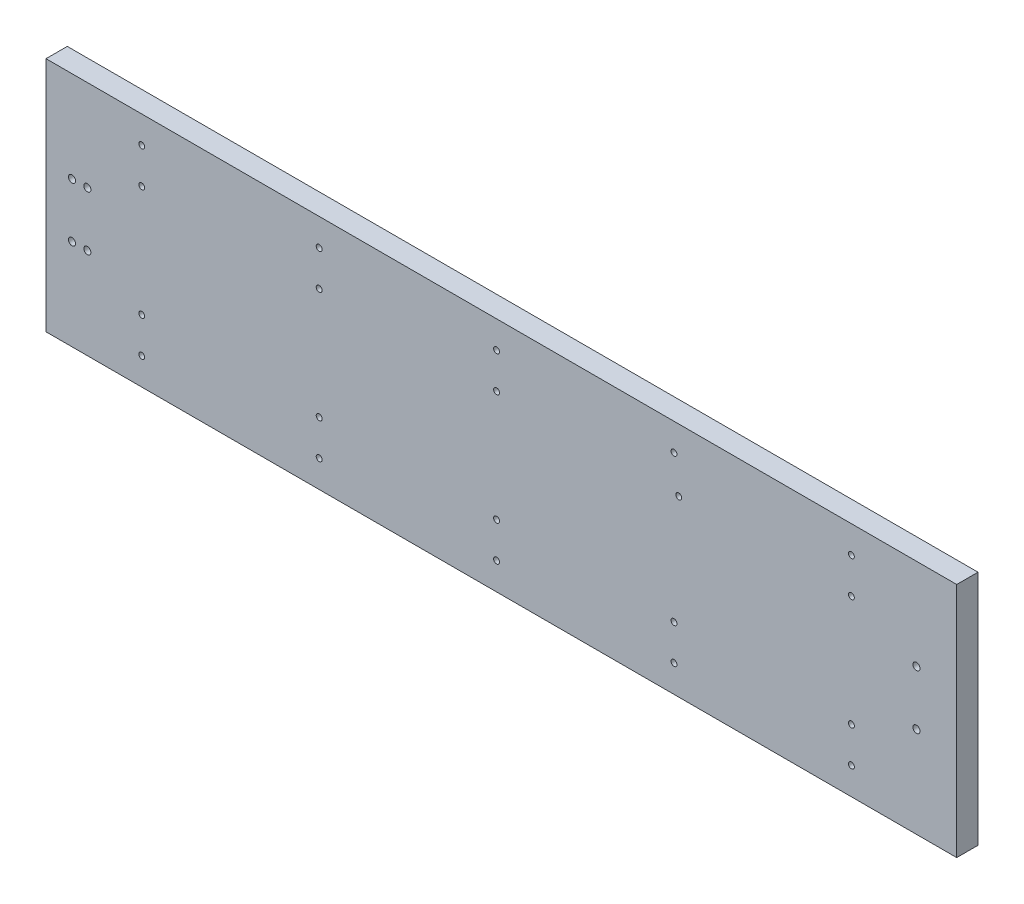
ISO-10303-21;
HEADER;
FILE_DESCRIPTION(('STEP AP214'),'2;1');
FILE_NAME('part.step','',(''),(''),'','','');
FILE_SCHEMA(('AUTOMOTIVE_DESIGN { 1 0 10303 214 1 1 1 1 }'));
ENDSEC;
DATA;
#1=APPLICATION_CONTEXT('core data for automotive mechanical design processes');
#2=APPLICATION_PROTOCOL_DEFINITION('international standard','automotive_design',2000,#1);
#3=PRODUCT_CONTEXT('',#1,'mechanical');
#4=PRODUCT('Part','Part','',(#3));
#5=PRODUCT_RELATED_PRODUCT_CATEGORY('part','',(#4));
#6=PRODUCT_DEFINITION_FORMATION('','',#4);
#7=PRODUCT_DEFINITION_CONTEXT('part definition',#1,'design');
#8=PRODUCT_DEFINITION('design','',#6,#7);
#9=PRODUCT_DEFINITION_SHAPE('','',#8);
#10=(LENGTH_UNIT() NAMED_UNIT(*) SI_UNIT(.MILLI.,.METRE.));
#11=(NAMED_UNIT(*) PLANE_ANGLE_UNIT() SI_UNIT($,.RADIAN.));
#12=(NAMED_UNIT(*) SI_UNIT($,.STERADIAN.) SOLID_ANGLE_UNIT());
#13=UNCERTAINTY_MEASURE_WITH_UNIT(LENGTH_MEASURE(1.E-05),#10,'distance_accuracy_value','');
#14=(GEOMETRIC_REPRESENTATION_CONTEXT(3) GLOBAL_UNCERTAINTY_ASSIGNED_CONTEXT((#13)) GLOBAL_UNIT_ASSIGNED_CONTEXT((#10,
#11,#12)) REPRESENTATION_CONTEXT('',''));
#15=CARTESIAN_POINT('',(0.,0.,0.));
#16=DIRECTION('',(0.,0.,1.));
#17=DIRECTION('',(1.,0.,0.));
#18=AXIS2_PLACEMENT_3D('',#15,#16,#17);
#19=CARTESIAN_POINT('',(0.,0.,18.));
#20=DIRECTION('',(0.,0.,1.));
#21=DIRECTION('',(1.,0.,0.));
#22=AXIS2_PLACEMENT_3D('',#19,#20,#21);
#23=PLANE('',#22);
#24=CARTESIAN_POINT('',(350.960797655733,23.,18.));
#25=DIRECTION('',(0.,0.,-1.));
#26=DIRECTION('',(-1.,0.,0.));
#27=AXIS2_PLACEMENT_3D('',#24,#25,#26);
#28=CIRCLE('',#27,3.);
#29=CARTESIAN_POINT('',(347.960797655733,23.,18.));
#30=VERTEX_POINT('',#29);
#31=EDGE_CURVE('E261',#30,#30,#28,.T.);
#32=ORIENTED_EDGE('',*,*,#31,.T.);
#33=EDGE_LOOP('',(#32));
#34=FACE_BOUND('',#33,.T.);
#35=CARTESIAN_POINT('',(350.960797655733,-23.,18.));
#36=DIRECTION('',(0.,0.,-1.));
#37=DIRECTION('',(-1.,0.,0.));
#38=AXIS2_PLACEMENT_3D('',#35,#36,#37);
#39=CIRCLE('',#38,3.);
#40=CARTESIAN_POINT('',(347.960797655733,-23.,18.));
#41=VERTEX_POINT('',#40);
#42=EDGE_CURVE('E255',#41,#41,#39,.T.);
#43=ORIENTED_EDGE('',*,*,#42,.T.);
#44=EDGE_LOOP('',(#43));
#45=FACE_BOUND('',#44,.T.);
#46=DIRECTION('',(0.,1.,0.));
#47=VECTOR('',#46,1.);
#48=CARTESIAN_POINT('',(385.,100.,18.));
#49=LINE('',#48,#47);
#50=CARTESIAN_POINT('',(385.,-100.,18.));
#51=VERTEX_POINT('',#50);
#52=CARTESIAN_POINT('',(385.,100.,18.));
#53=VERTEX_POINT('',#52);
#54=EDGE_CURVE('E85',#51,#53,#49,.T.);
#55=ORIENTED_EDGE('',*,*,#54,.T.);
#56=DIRECTION('',(-1.,0.,0.));
#57=VECTOR('',#56,1.);
#58=CARTESIAN_POINT('',(-385.,100.,18.));
#59=LINE('',#58,#57);
#60=CARTESIAN_POINT('',(-385.,100.,18.));
#61=VERTEX_POINT('',#60);
#62=EDGE_CURVE('E80',#53,#61,#59,.T.);
#63=ORIENTED_EDGE('',*,*,#62,.T.);
#64=DIRECTION('',(0.,-1.,0.));
#65=VECTOR('',#64,1.);
#66=CARTESIAN_POINT('',(-385.,100.,18.));
#67=LINE('',#66,#65);
#68=CARTESIAN_POINT('',(-385.,-100.,18.));
#69=VERTEX_POINT('',#68);
#70=EDGE_CURVE('E83',#61,#69,#67,.T.);
#71=ORIENTED_EDGE('',*,*,#70,.T.);
#72=DIRECTION('',(1.,0.,0.));
#73=VECTOR('',#72,1.);
#74=CARTESIAN_POINT('',(-385.,-100.,18.));
#75=LINE('',#74,#73);
#76=EDGE_CURVE('E50',#69,#51,#75,.T.);
#77=ORIENTED_EDGE('',*,*,#76,.T.);
#78=EDGE_LOOP('',(#55,#63,#71,#77));
#79=FACE_BOUND('',#78,.T.);
#80=CARTESIAN_POINT('',(295.960122186734,-77.0000000000001,18.));
#81=DIRECTION('',(0.,0.,-1.));
#82=DIRECTION('',(-1.,0.,0.));
#83=AXIS2_PLACEMENT_3D('',#80,#81,#82);
#84=CIRCLE('',#83,2.5);
#85=CARTESIAN_POINT('',(293.460122186734,-77.0000000000001,18.));
#86=VERTEX_POINT('',#85);
#87=EDGE_CURVE('E100',#86,#86,#84,.T.);
#88=ORIENTED_EDGE('',*,*,#87,.T.);
#89=EDGE_LOOP('',(#88));
#90=FACE_BOUND('',#89,.T.);
#91=CARTESIAN_POINT('',(295.960122186734,-47.0000000000001,18.));
#92=DIRECTION('',(0.,0.,-1.));
#93=DIRECTION('',(-1.,0.,0.));
#94=AXIS2_PLACEMENT_3D('',#91,#92,#93);
#95=CIRCLE('',#94,2.5);
#96=CARTESIAN_POINT('',(293.460122186734,-47.0000000000001,18.));
#97=VERTEX_POINT('',#96);
#98=EDGE_CURVE('E117',#97,#97,#95,.T.);
#99=ORIENTED_EDGE('',*,*,#98,.T.);
#100=EDGE_LOOP('',(#99));
#101=FACE_BOUND('',#100,.T.);
#102=CARTESIAN_POINT('',(145.960122186734,-47.,18.));
#103=DIRECTION('',(0.,0.,-1.));
#104=DIRECTION('',(-1.,0.,0.));
#105=AXIS2_PLACEMENT_3D('',#102,#103,#104);
#106=CIRCLE('',#105,2.5);
#107=CARTESIAN_POINT('',(143.460122186734,-47.,18.));
#108=VERTEX_POINT('',#107);
#109=EDGE_CURVE('E123',#108,#108,#106,.T.);
#110=ORIENTED_EDGE('',*,*,#109,.T.);
#111=EDGE_LOOP('',(#110));
#112=FACE_BOUND('',#111,.T.);
#113=CARTESIAN_POINT('',(145.960122186734,-77.,18.));
#114=DIRECTION('',(0.,0.,-1.));
#115=DIRECTION('',(-1.,0.,0.));
#116=AXIS2_PLACEMENT_3D('',#113,#114,#115);
#117=CIRCLE('',#116,2.5);
#118=CARTESIAN_POINT('',(143.460122186734,-77.,18.));
#119=VERTEX_POINT('',#118);
#120=EDGE_CURVE('E129',#119,#119,#117,.T.);
#121=ORIENTED_EDGE('',*,*,#120,.T.);
#122=EDGE_LOOP('',(#121));
#123=FACE_BOUND('',#122,.T.);
#124=CARTESIAN_POINT('',(-4.03987781326559,-76.9999999999999,18.));
#125=DIRECTION('',(0.,0.,-1.));
#126=DIRECTION('',(-1.,0.,0.));
#127=AXIS2_PLACEMENT_3D('',#124,#125,#126);
#128=CIRCLE('',#127,2.49999999999999);
#129=CARTESIAN_POINT('',(-6.53987781326558,-76.9999999999999,18.));
#130=VERTEX_POINT('',#129);
#131=EDGE_CURVE('E135',#130,#130,#128,.T.);
#132=ORIENTED_EDGE('',*,*,#131,.T.);
#133=EDGE_LOOP('',(#132));
#134=FACE_BOUND('',#133,.T.);
#135=CARTESIAN_POINT('',(-4.03987781326559,-46.9999999999999,18.));
#136=DIRECTION('',(0.,0.,-1.));
#137=DIRECTION('',(-1.,0.,0.));
#138=AXIS2_PLACEMENT_3D('',#135,#136,#137);
#139=CIRCLE('',#138,2.49999999999999);
#140=CARTESIAN_POINT('',(-6.53987781326558,-46.9999999999999,18.));
#141=VERTEX_POINT('',#140);
#142=EDGE_CURVE('E141',#141,#141,#139,.T.);
#143=ORIENTED_EDGE('',*,*,#142,.T.);
#144=EDGE_LOOP('',(#143));
#145=FACE_BOUND('',#144,.T.);
#146=CARTESIAN_POINT('',(-154.039877813266,-46.9999999999998,18.));
#147=DIRECTION('',(0.,0.,-1.));
#148=DIRECTION('',(-1.,0.,0.));
#149=AXIS2_PLACEMENT_3D('',#146,#147,#148);
#150=CIRCLE('',#149,2.5);
#151=CARTESIAN_POINT('',(-156.539877813266,-46.9999999999998,18.));
#152=VERTEX_POINT('',#151);
#153=EDGE_CURVE('E147',#152,#152,#150,.T.);
#154=ORIENTED_EDGE('',*,*,#153,.T.);
#155=EDGE_LOOP('',(#154));
#156=FACE_BOUND('',#155,.T.);
#157=CARTESIAN_POINT('',(-154.039877813266,-76.9999999999998,18.));
#158=DIRECTION('',(0.,0.,-1.));
#159=DIRECTION('',(-1.,0.,0.));
#160=AXIS2_PLACEMENT_3D('',#157,#158,#159);
#161=CIRCLE('',#160,2.5);
#162=CARTESIAN_POINT('',(-156.539877813266,-76.9999999999998,18.));
#163=VERTEX_POINT('',#162);
#164=EDGE_CURVE('E153',#163,#163,#161,.T.);
#165=ORIENTED_EDGE('',*,*,#164,.T.);
#166=EDGE_LOOP('',(#165));
#167=FACE_BOUND('',#166,.T.);
#168=CARTESIAN_POINT('',(-304.039877813266,-76.9999999999997,18.));
#169=DIRECTION('',(0.,0.,-1.));
#170=DIRECTION('',(-1.,0.,0.));
#171=AXIS2_PLACEMENT_3D('',#168,#169,#170);
#172=CIRCLE('',#171,2.5);
#173=CARTESIAN_POINT('',(-306.539877813266,-76.9999999999997,18.));
#174=VERTEX_POINT('',#173);
#175=EDGE_CURVE('E159',#174,#174,#172,.T.);
#176=ORIENTED_EDGE('',*,*,#175,.T.);
#177=EDGE_LOOP('',(#176));
#178=FACE_BOUND('',#177,.T.);
#179=CARTESIAN_POINT('',(-304.039877813266,-46.9999999999997,18.));
#180=DIRECTION('',(0.,0.,-1.));
#181=DIRECTION('',(-1.,0.,0.));
#182=AXIS2_PLACEMENT_3D('',#179,#180,#181);
#183=CIRCLE('',#182,2.5);
#184=CARTESIAN_POINT('',(-306.539877813266,-46.9999999999997,18.));
#185=VERTEX_POINT('',#184);
#186=EDGE_CURVE('E165',#185,#185,#183,.T.);
#187=ORIENTED_EDGE('',*,*,#186,.T.);
#188=EDGE_LOOP('',(#187));
#189=FACE_BOUND('',#188,.T.);
#190=CARTESIAN_POINT('',(-304.039877813266,47.0000000000004,18.));
#191=DIRECTION('',(0.,0.,-1.));
#192=DIRECTION('',(-1.,0.,0.));
#193=AXIS2_PLACEMENT_3D('',#190,#191,#192);
#194=CIRCLE('',#193,2.5);
#195=CARTESIAN_POINT('',(-306.539877813266,47.0000000000004,18.));
#196=VERTEX_POINT('',#195);
#197=EDGE_CURVE('E171',#196,#196,#194,.T.);
#198=ORIENTED_EDGE('',*,*,#197,.T.);
#199=EDGE_LOOP('',(#198));
#200=FACE_BOUND('',#199,.T.);
#201=CARTESIAN_POINT('',(-304.039877813266,77.0000000000004,18.));
#202=DIRECTION('',(0.,0.,-1.));
#203=DIRECTION('',(-1.,0.,0.));
#204=AXIS2_PLACEMENT_3D('',#201,#202,#203);
#205=CIRCLE('',#204,2.5);
#206=CARTESIAN_POINT('',(-306.539877813266,77.0000000000004,18.));
#207=VERTEX_POINT('',#206);
#208=EDGE_CURVE('E177',#207,#207,#205,.T.);
#209=ORIENTED_EDGE('',*,*,#208,.T.);
#210=EDGE_LOOP('',(#209));
#211=FACE_BOUND('',#210,.T.);
#212=CARTESIAN_POINT('',(-154.039877813266,47.0000000000004,18.));
#213=DIRECTION('',(0.,0.,-1.));
#214=DIRECTION('',(-1.,0.,0.));
#215=AXIS2_PLACEMENT_3D('',#212,#213,#214);
#216=CIRCLE('',#215,2.5);
#217=CARTESIAN_POINT('',(-156.539877813266,47.0000000000004,18.));
#218=VERTEX_POINT('',#217);
#219=EDGE_CURVE('E183',#218,#218,#216,.T.);
#220=ORIENTED_EDGE('',*,*,#219,.T.);
#221=EDGE_LOOP('',(#220));
#222=FACE_BOUND('',#221,.T.);
#223=CARTESIAN_POINT('',(-154.039877813266,77.0000000000004,18.));
#224=DIRECTION('',(0.,0.,-1.));
#225=DIRECTION('',(-1.,0.,0.));
#226=AXIS2_PLACEMENT_3D('',#223,#224,#225);
#227=CIRCLE('',#226,2.5);
#228=CARTESIAN_POINT('',(-156.539877813266,77.0000000000004,18.));
#229=VERTEX_POINT('',#228);
#230=EDGE_CURVE('E189',#229,#229,#227,.T.);
#231=ORIENTED_EDGE('',*,*,#230,.T.);
#232=EDGE_LOOP('',(#231));
#233=FACE_BOUND('',#232,.T.);
#234=CARTESIAN_POINT('',(-4.03987781326598,47.0000000000004,18.));
#235=DIRECTION('',(0.,0.,-1.));
#236=DIRECTION('',(-1.,0.,0.));
#237=AXIS2_PLACEMENT_3D('',#234,#235,#236);
#238=CIRCLE('',#237,2.49999999999999);
#239=CARTESIAN_POINT('',(-6.53987781326597,47.0000000000004,18.));
#240=VERTEX_POINT('',#239);
#241=EDGE_CURVE('E195',#240,#240,#238,.T.);
#242=ORIENTED_EDGE('',*,*,#241,.T.);
#243=EDGE_LOOP('',(#242));
#244=FACE_BOUND('',#243,.T.);
#245=CARTESIAN_POINT('',(-4.03987781326598,77.0000000000004,18.));
#246=DIRECTION('',(0.,0.,-1.));
#247=DIRECTION('',(-1.,0.,0.));
#248=AXIS2_PLACEMENT_3D('',#245,#246,#247);
#249=CIRCLE('',#248,2.49999999999999);
#250=CARTESIAN_POINT('',(-6.53987781326597,77.0000000000004,18.));
#251=VERTEX_POINT('',#250);
#252=EDGE_CURVE('E201',#251,#251,#249,.T.);
#253=ORIENTED_EDGE('',*,*,#252,.T.);
#254=EDGE_LOOP('',(#253));
#255=FACE_BOUND('',#254,.T.);
#256=CARTESIAN_POINT('',(150.,47.0000000000002,18.));
#257=DIRECTION('',(0.,0.,-1.));
#258=DIRECTION('',(-1.,0.,0.));
#259=AXIS2_PLACEMENT_3D('',#256,#257,#258);
#260=CIRCLE('',#259,2.5);
#261=CARTESIAN_POINT('',(147.5,47.0000000000002,18.));
#262=VERTEX_POINT('',#261);
#263=EDGE_CURVE('E207',#262,#262,#260,.T.);
#264=ORIENTED_EDGE('',*,*,#263,.T.);
#265=EDGE_LOOP('',(#264));
#266=FACE_BOUND('',#265,.T.);
#267=CARTESIAN_POINT('',(145.960122186734,77.0000000000004,18.));
#268=DIRECTION('',(0.,0.,-1.));
#269=DIRECTION('',(-1.,0.,0.));
#270=AXIS2_PLACEMENT_3D('',#267,#268,#269);
#271=CIRCLE('',#270,2.5);
#272=CARTESIAN_POINT('',(143.460122186734,77.0000000000004,18.));
#273=VERTEX_POINT('',#272);
#274=EDGE_CURVE('E213',#273,#273,#271,.T.);
#275=ORIENTED_EDGE('',*,*,#274,.T.);
#276=EDGE_LOOP('',(#275));
#277=FACE_BOUND('',#276,.T.);
#278=CARTESIAN_POINT('',(295.960122186734,47.0000000000004,18.));
#279=DIRECTION('',(0.,0.,-1.));
#280=DIRECTION('',(-1.,0.,0.));
#281=AXIS2_PLACEMENT_3D('',#278,#279,#280);
#282=CIRCLE('',#281,2.5);
#283=CARTESIAN_POINT('',(293.460122186734,47.0000000000004,18.));
#284=VERTEX_POINT('',#283);
#285=EDGE_CURVE('E219',#284,#284,#282,.T.);
#286=ORIENTED_EDGE('',*,*,#285,.T.);
#287=EDGE_LOOP('',(#286));
#288=FACE_BOUND('',#287,.T.);
#289=CARTESIAN_POINT('',(295.960122186734,77.0000000000004,18.));
#290=DIRECTION('',(0.,0.,-1.));
#291=DIRECTION('',(-1.,0.,0.));
#292=AXIS2_PLACEMENT_3D('',#289,#290,#291);
#293=CIRCLE('',#292,2.5);
#294=CARTESIAN_POINT('',(293.460122186734,77.0000000000004,18.));
#295=VERTEX_POINT('',#294);
#296=EDGE_CURVE('E225',#295,#295,#293,.T.);
#297=ORIENTED_EDGE('',*,*,#296,.T.);
#298=EDGE_LOOP('',(#297));
#299=FACE_BOUND('',#298,.T.);
#300=CARTESIAN_POINT('',(-363.039202344268,-22.9999999999999,18.));
#301=DIRECTION('',(0.,0.,-1.));
#302=DIRECTION('',(-1.,0.,0.));
#303=AXIS2_PLACEMENT_3D('',#300,#301,#302);
#304=CIRCLE('',#303,3.);
#305=CARTESIAN_POINT('',(-366.039202344268,-22.9999999999999,18.));
#306=VERTEX_POINT('',#305);
#307=EDGE_CURVE('E231',#306,#306,#304,.T.);
#308=ORIENTED_EDGE('',*,*,#307,.T.);
#309=EDGE_LOOP('',(#308));
#310=FACE_BOUND('',#309,.T.);
#311=CARTESIAN_POINT('',(-350.039202344268,-22.9999999999999,18.));
#312=DIRECTION('',(0.,0.,-1.));
#313=DIRECTION('',(-1.,0.,0.));
#314=AXIS2_PLACEMENT_3D('',#311,#312,#313);
#315=CIRCLE('',#314,3.);
#316=CARTESIAN_POINT('',(-353.039202344268,-22.9999999999999,18.));
#317=VERTEX_POINT('',#316);
#318=EDGE_CURVE('E237',#317,#317,#315,.T.);
#319=ORIENTED_EDGE('',*,*,#318,.T.);
#320=EDGE_LOOP('',(#319));
#321=FACE_BOUND('',#320,.T.);
#322=CARTESIAN_POINT('',(-363.039202344268,23.0000000000001,18.));
#323=DIRECTION('',(0.,0.,-1.));
#324=DIRECTION('',(-1.,0.,0.));
#325=AXIS2_PLACEMENT_3D('',#322,#323,#324);
#326=CIRCLE('',#325,3.);
#327=CARTESIAN_POINT('',(-366.039202344268,23.0000000000001,18.));
#328=VERTEX_POINT('',#327);
#329=EDGE_CURVE('E243',#328,#328,#326,.T.);
#330=ORIENTED_EDGE('',*,*,#329,.T.);
#331=EDGE_LOOP('',(#330));
#332=FACE_BOUND('',#331,.T.);
#333=CARTESIAN_POINT('',(-350.039202344268,23.0000000000001,18.));
#334=DIRECTION('',(0.,0.,-1.));
#335=DIRECTION('',(-1.,0.,0.));
#336=AXIS2_PLACEMENT_3D('',#333,#334,#335);
#337=CIRCLE('',#336,3.);
#338=CARTESIAN_POINT('',(-353.039202344268,23.0000000000001,18.));
#339=VERTEX_POINT('',#338);
#340=EDGE_CURVE('E249',#339,#339,#337,.T.);
#341=ORIENTED_EDGE('',*,*,#340,.T.);
#342=EDGE_LOOP('',(#341));
#343=FACE_BOUND('',#342,.T.);
#344=ADVANCED_FACE('F33',(#34,#45,#79,#90,#101,#112,#123,#134,#145,#156,#167,#178,#189,#200,
#211,#222,#233,#244,#255,#266,#277,#288,#299,#310,#321,#332,#343),#23,.T.);
#345=CARTESIAN_POINT('',(0.,0.,0.));
#346=DIRECTION('',(0.,0.,1.));
#347=DIRECTION('',(1.,0.,0.));
#348=AXIS2_PLACEMENT_3D('',#345,#346,#347);
#349=PLANE('',#348);
#350=CARTESIAN_POINT('',(350.960797655733,23.,0.));
#351=DIRECTION('',(0.,0.,-1.));
#352=DIRECTION('',(-1.,0.,0.));
#353=AXIS2_PLACEMENT_3D('',#350,#351,#352);
#354=CIRCLE('',#353,3.);
#355=CARTESIAN_POINT('',(347.960797655733,23.,0.));
#356=VERTEX_POINT('',#355);
#357=EDGE_CURVE('E264',#356,#356,#354,.T.);
#358=ORIENTED_EDGE('',*,*,#357,.F.);
#359=EDGE_LOOP('',(#358));
#360=FACE_BOUND('',#359,.T.);
#361=CARTESIAN_POINT('',(350.960797655733,-23.,0.));
#362=DIRECTION('',(0.,0.,-1.));
#363=DIRECTION('',(-1.,0.,0.));
#364=AXIS2_PLACEMENT_3D('',#361,#362,#363);
#365=CIRCLE('',#364,3.);
#366=CARTESIAN_POINT('',(347.960797655733,-23.,0.));
#367=VERTEX_POINT('',#366);
#368=EDGE_CURVE('E258',#367,#367,#365,.T.);
#369=ORIENTED_EDGE('',*,*,#368,.F.);
#370=EDGE_LOOP('',(#369));
#371=FACE_BOUND('',#370,.T.);
#372=CARTESIAN_POINT('',(-350.039202344268,23.0000000000001,0.));
#373=DIRECTION('',(0.,0.,-1.));
#374=DIRECTION('',(-1.,0.,0.));
#375=AXIS2_PLACEMENT_3D('',#372,#373,#374);
#376=CIRCLE('',#375,3.);
#377=CARTESIAN_POINT('',(-353.039202344268,23.0000000000001,0.));
#378=VERTEX_POINT('',#377);
#379=EDGE_CURVE('E252',#378,#378,#376,.T.);
#380=ORIENTED_EDGE('',*,*,#379,.F.);
#381=EDGE_LOOP('',(#380));
#382=FACE_BOUND('',#381,.T.);
#383=DIRECTION('',(0.,1.,0.));
#384=VECTOR('',#383,1.);
#385=CARTESIAN_POINT('',(385.,100.,0.));
#386=LINE('',#385,#384);
#387=CARTESIAN_POINT('',(385.,-100.,0.));
#388=VERTEX_POINT('',#387);
#389=CARTESIAN_POINT('',(385.,100.,0.));
#390=VERTEX_POINT('',#389);
#391=EDGE_CURVE('E97',#388,#390,#386,.T.);
#392=ORIENTED_EDGE('',*,*,#391,.F.);
#393=DIRECTION('',(1.,0.,0.));
#394=VECTOR('',#393,1.);
#395=CARTESIAN_POINT('',(-385.,-100.,0.));
#396=LINE('',#395,#394);
#397=CARTESIAN_POINT('',(-385.,-100.,0.));
#398=VERTEX_POINT('',#397);
#399=EDGE_CURVE('E73',#398,#388,#396,.T.);
#400=ORIENTED_EDGE('',*,*,#399,.F.);
#401=DIRECTION('',(0.,-1.,0.));
#402=VECTOR('',#401,1.);
#403=CARTESIAN_POINT('',(-385.,100.,0.));
#404=LINE('',#403,#402);
#405=CARTESIAN_POINT('',(-385.,100.,0.));
#406=VERTEX_POINT('',#405);
#407=EDGE_CURVE('E67',#406,#398,#404,.T.);
#408=ORIENTED_EDGE('',*,*,#407,.F.);
#409=DIRECTION('',(-1.,0.,0.));
#410=VECTOR('',#409,1.);
#411=CARTESIAN_POINT('',(-385.,100.,0.));
#412=LINE('',#411,#410);
#413=EDGE_CURVE('E89',#390,#406,#412,.T.);
#414=ORIENTED_EDGE('',*,*,#413,.F.);
#415=EDGE_LOOP('',(#392,#400,#408,#414));
#416=FACE_BOUND('',#415,.T.);
#417=CARTESIAN_POINT('',(295.960122186734,-77.0000000000001,0.));
#418=DIRECTION('',(0.,0.,-1.));
#419=DIRECTION('',(-1.,0.,0.));
#420=AXIS2_PLACEMENT_3D('',#417,#418,#419);
#421=CIRCLE('',#420,2.5);
#422=CARTESIAN_POINT('',(293.460122186734,-77.0000000000001,0.));
#423=VERTEX_POINT('',#422);
#424=EDGE_CURVE('E114',#423,#423,#421,.T.);
#425=ORIENTED_EDGE('',*,*,#424,.F.);
#426=EDGE_LOOP('',(#425));
#427=FACE_BOUND('',#426,.T.);
#428=CARTESIAN_POINT('',(295.960122186734,-47.0000000000001,0.));
#429=DIRECTION('',(0.,0.,-1.));
#430=DIRECTION('',(-1.,0.,0.));
#431=AXIS2_PLACEMENT_3D('',#428,#429,#430);
#432=CIRCLE('',#431,2.5);
#433=CARTESIAN_POINT('',(293.460122186734,-47.0000000000001,0.));
#434=VERTEX_POINT('',#433);
#435=EDGE_CURVE('E120',#434,#434,#432,.T.);
#436=ORIENTED_EDGE('',*,*,#435,.F.);
#437=EDGE_LOOP('',(#436));
#438=FACE_BOUND('',#437,.T.);
#439=CARTESIAN_POINT('',(145.960122186734,-47.,0.));
#440=DIRECTION('',(0.,0.,-1.));
#441=DIRECTION('',(-1.,0.,0.));
#442=AXIS2_PLACEMENT_3D('',#439,#440,#441);
#443=CIRCLE('',#442,2.5);
#444=CARTESIAN_POINT('',(143.460122186734,-47.,0.));
#445=VERTEX_POINT('',#444);
#446=EDGE_CURVE('E126',#445,#445,#443,.T.);
#447=ORIENTED_EDGE('',*,*,#446,.F.);
#448=EDGE_LOOP('',(#447));
#449=FACE_BOUND('',#448,.T.);
#450=CARTESIAN_POINT('',(145.960122186734,-77.,0.));
#451=DIRECTION('',(0.,0.,-1.));
#452=DIRECTION('',(-1.,0.,0.));
#453=AXIS2_PLACEMENT_3D('',#450,#451,#452);
#454=CIRCLE('',#453,2.5);
#455=CARTESIAN_POINT('',(143.460122186734,-77.,0.));
#456=VERTEX_POINT('',#455);
#457=EDGE_CURVE('E132',#456,#456,#454,.T.);
#458=ORIENTED_EDGE('',*,*,#457,.F.);
#459=EDGE_LOOP('',(#458));
#460=FACE_BOUND('',#459,.T.);
#461=CARTESIAN_POINT('',(-4.03987781326559,-76.9999999999999,0.));
#462=DIRECTION('',(0.,0.,-1.));
#463=DIRECTION('',(-1.,0.,0.));
#464=AXIS2_PLACEMENT_3D('',#461,#462,#463);
#465=CIRCLE('',#464,2.49999999999999);
#466=CARTESIAN_POINT('',(-6.53987781326558,-76.9999999999999,0.));
#467=VERTEX_POINT('',#466);
#468=EDGE_CURVE('E138',#467,#467,#465,.T.);
#469=ORIENTED_EDGE('',*,*,#468,.F.);
#470=EDGE_LOOP('',(#469));
#471=FACE_BOUND('',#470,.T.);
#472=CARTESIAN_POINT('',(-4.03987781326559,-46.9999999999999,0.));
#473=DIRECTION('',(0.,0.,-1.));
#474=DIRECTION('',(-1.,0.,0.));
#475=AXIS2_PLACEMENT_3D('',#472,#473,#474);
#476=CIRCLE('',#475,2.49999999999999);
#477=CARTESIAN_POINT('',(-6.53987781326558,-46.9999999999999,0.));
#478=VERTEX_POINT('',#477);
#479=EDGE_CURVE('E144',#478,#478,#476,.T.);
#480=ORIENTED_EDGE('',*,*,#479,.F.);
#481=EDGE_LOOP('',(#480));
#482=FACE_BOUND('',#481,.T.);
#483=CARTESIAN_POINT('',(-154.039877813266,-46.9999999999998,0.));
#484=DIRECTION('',(0.,0.,-1.));
#485=DIRECTION('',(-1.,0.,0.));
#486=AXIS2_PLACEMENT_3D('',#483,#484,#485);
#487=CIRCLE('',#486,2.5);
#488=CARTESIAN_POINT('',(-156.539877813266,-46.9999999999998,0.));
#489=VERTEX_POINT('',#488);
#490=EDGE_CURVE('E150',#489,#489,#487,.T.);
#491=ORIENTED_EDGE('',*,*,#490,.F.);
#492=EDGE_LOOP('',(#491));
#493=FACE_BOUND('',#492,.T.);
#494=CARTESIAN_POINT('',(-154.039877813266,-76.9999999999998,0.));
#495=DIRECTION('',(0.,0.,-1.));
#496=DIRECTION('',(-1.,0.,0.));
#497=AXIS2_PLACEMENT_3D('',#494,#495,#496);
#498=CIRCLE('',#497,2.5);
#499=CARTESIAN_POINT('',(-156.539877813266,-76.9999999999998,0.));
#500=VERTEX_POINT('',#499);
#501=EDGE_CURVE('E156',#500,#500,#498,.T.);
#502=ORIENTED_EDGE('',*,*,#501,.F.);
#503=EDGE_LOOP('',(#502));
#504=FACE_BOUND('',#503,.T.);
#505=CARTESIAN_POINT('',(-304.039877813266,-76.9999999999997,0.));
#506=DIRECTION('',(0.,0.,-1.));
#507=DIRECTION('',(-1.,0.,0.));
#508=AXIS2_PLACEMENT_3D('',#505,#506,#507);
#509=CIRCLE('',#508,2.5);
#510=CARTESIAN_POINT('',(-306.539877813266,-76.9999999999997,0.));
#511=VERTEX_POINT('',#510);
#512=EDGE_CURVE('E162',#511,#511,#509,.T.);
#513=ORIENTED_EDGE('',*,*,#512,.F.);
#514=EDGE_LOOP('',(#513));
#515=FACE_BOUND('',#514,.T.);
#516=CARTESIAN_POINT('',(-304.039877813266,-46.9999999999997,0.));
#517=DIRECTION('',(0.,0.,-1.));
#518=DIRECTION('',(-1.,0.,0.));
#519=AXIS2_PLACEMENT_3D('',#516,#517,#518);
#520=CIRCLE('',#519,2.5);
#521=CARTESIAN_POINT('',(-306.539877813266,-46.9999999999997,0.));
#522=VERTEX_POINT('',#521);
#523=EDGE_CURVE('E168',#522,#522,#520,.T.);
#524=ORIENTED_EDGE('',*,*,#523,.F.);
#525=EDGE_LOOP('',(#524));
#526=FACE_BOUND('',#525,.T.);
#527=CARTESIAN_POINT('',(-304.039877813266,47.0000000000004,0.));
#528=DIRECTION('',(0.,0.,-1.));
#529=DIRECTION('',(-1.,0.,0.));
#530=AXIS2_PLACEMENT_3D('',#527,#528,#529);
#531=CIRCLE('',#530,2.5);
#532=CARTESIAN_POINT('',(-306.539877813266,47.0000000000004,0.));
#533=VERTEX_POINT('',#532);
#534=EDGE_CURVE('E174',#533,#533,#531,.T.);
#535=ORIENTED_EDGE('',*,*,#534,.F.);
#536=EDGE_LOOP('',(#535));
#537=FACE_BOUND('',#536,.T.);
#538=CARTESIAN_POINT('',(-304.039877813266,77.0000000000004,0.));
#539=DIRECTION('',(0.,0.,-1.));
#540=DIRECTION('',(-1.,0.,0.));
#541=AXIS2_PLACEMENT_3D('',#538,#539,#540);
#542=CIRCLE('',#541,2.5);
#543=CARTESIAN_POINT('',(-306.539877813266,77.0000000000004,0.));
#544=VERTEX_POINT('',#543);
#545=EDGE_CURVE('E180',#544,#544,#542,.T.);
#546=ORIENTED_EDGE('',*,*,#545,.F.);
#547=EDGE_LOOP('',(#546));
#548=FACE_BOUND('',#547,.T.);
#549=CARTESIAN_POINT('',(-154.039877813266,47.0000000000004,0.));
#550=DIRECTION('',(0.,0.,-1.));
#551=DIRECTION('',(-1.,0.,0.));
#552=AXIS2_PLACEMENT_3D('',#549,#550,#551);
#553=CIRCLE('',#552,2.5);
#554=CARTESIAN_POINT('',(-156.539877813266,47.0000000000004,0.));
#555=VERTEX_POINT('',#554);
#556=EDGE_CURVE('E186',#555,#555,#553,.T.);
#557=ORIENTED_EDGE('',*,*,#556,.F.);
#558=EDGE_LOOP('',(#557));
#559=FACE_BOUND('',#558,.T.);
#560=CARTESIAN_POINT('',(-154.039877813266,77.0000000000004,0.));
#561=DIRECTION('',(0.,0.,-1.));
#562=DIRECTION('',(-1.,0.,0.));
#563=AXIS2_PLACEMENT_3D('',#560,#561,#562);
#564=CIRCLE('',#563,2.5);
#565=CARTESIAN_POINT('',(-156.539877813266,77.0000000000004,0.));
#566=VERTEX_POINT('',#565);
#567=EDGE_CURVE('E192',#566,#566,#564,.T.);
#568=ORIENTED_EDGE('',*,*,#567,.F.);
#569=EDGE_LOOP('',(#568));
#570=FACE_BOUND('',#569,.T.);
#571=CARTESIAN_POINT('',(-4.03987781326598,47.0000000000004,0.));
#572=DIRECTION('',(0.,0.,-1.));
#573=DIRECTION('',(-1.,0.,0.));
#574=AXIS2_PLACEMENT_3D('',#571,#572,#573);
#575=CIRCLE('',#574,2.49999999999999);
#576=CARTESIAN_POINT('',(-6.53987781326597,47.0000000000004,0.));
#577=VERTEX_POINT('',#576);
#578=EDGE_CURVE('E198',#577,#577,#575,.T.);
#579=ORIENTED_EDGE('',*,*,#578,.F.);
#580=EDGE_LOOP('',(#579));
#581=FACE_BOUND('',#580,.T.);
#582=CARTESIAN_POINT('',(-4.03987781326598,77.0000000000004,0.));
#583=DIRECTION('',(0.,0.,-1.));
#584=DIRECTION('',(-1.,0.,0.));
#585=AXIS2_PLACEMENT_3D('',#582,#583,#584);
#586=CIRCLE('',#585,2.49999999999999);
#587=CARTESIAN_POINT('',(-6.53987781326597,77.0000000000004,0.));
#588=VERTEX_POINT('',#587);
#589=EDGE_CURVE('E204',#588,#588,#586,.T.);
#590=ORIENTED_EDGE('',*,*,#589,.F.);
#591=EDGE_LOOP('',(#590));
#592=FACE_BOUND('',#591,.T.);
#593=CARTESIAN_POINT('',(150.,47.0000000000002,0.));
#594=DIRECTION('',(0.,0.,-1.));
#595=DIRECTION('',(-1.,0.,0.));
#596=AXIS2_PLACEMENT_3D('',#593,#594,#595);
#597=CIRCLE('',#596,2.5);
#598=CARTESIAN_POINT('',(147.5,47.0000000000002,0.));
#599=VERTEX_POINT('',#598);
#600=EDGE_CURVE('E210',#599,#599,#597,.T.);
#601=ORIENTED_EDGE('',*,*,#600,.F.);
#602=EDGE_LOOP('',(#601));
#603=FACE_BOUND('',#602,.T.);
#604=CARTESIAN_POINT('',(145.960122186734,77.0000000000004,0.));
#605=DIRECTION('',(0.,0.,-1.));
#606=DIRECTION('',(-1.,0.,0.));
#607=AXIS2_PLACEMENT_3D('',#604,#605,#606);
#608=CIRCLE('',#607,2.5);
#609=CARTESIAN_POINT('',(143.460122186734,77.0000000000004,0.));
#610=VERTEX_POINT('',#609);
#611=EDGE_CURVE('E216',#610,#610,#608,.T.);
#612=ORIENTED_EDGE('',*,*,#611,.F.);
#613=EDGE_LOOP('',(#612));
#614=FACE_BOUND('',#613,.T.);
#615=CARTESIAN_POINT('',(295.960122186734,47.0000000000004,0.));
#616=DIRECTION('',(0.,0.,-1.));
#617=DIRECTION('',(-1.,0.,0.));
#618=AXIS2_PLACEMENT_3D('',#615,#616,#617);
#619=CIRCLE('',#618,2.5);
#620=CARTESIAN_POINT('',(293.460122186734,47.0000000000004,0.));
#621=VERTEX_POINT('',#620);
#622=EDGE_CURVE('E222',#621,#621,#619,.T.);
#623=ORIENTED_EDGE('',*,*,#622,.F.);
#624=EDGE_LOOP('',(#623));
#625=FACE_BOUND('',#624,.T.);
#626=CARTESIAN_POINT('',(295.960122186734,77.0000000000004,0.));
#627=DIRECTION('',(0.,0.,-1.));
#628=DIRECTION('',(-1.,0.,0.));
#629=AXIS2_PLACEMENT_3D('',#626,#627,#628);
#630=CIRCLE('',#629,2.5);
#631=CARTESIAN_POINT('',(293.460122186734,77.0000000000004,0.));
#632=VERTEX_POINT('',#631);
#633=EDGE_CURVE('E228',#632,#632,#630,.T.);
#634=ORIENTED_EDGE('',*,*,#633,.F.);
#635=EDGE_LOOP('',(#634));
#636=FACE_BOUND('',#635,.T.);
#637=CARTESIAN_POINT('',(-363.039202344268,-22.9999999999999,0.));
#638=DIRECTION('',(0.,0.,-1.));
#639=DIRECTION('',(-1.,0.,0.));
#640=AXIS2_PLACEMENT_3D('',#637,#638,#639);
#641=CIRCLE('',#640,3.);
#642=CARTESIAN_POINT('',(-366.039202344268,-22.9999999999999,0.));
#643=VERTEX_POINT('',#642);
#644=EDGE_CURVE('E234',#643,#643,#641,.T.);
#645=ORIENTED_EDGE('',*,*,#644,.F.);
#646=EDGE_LOOP('',(#645));
#647=FACE_BOUND('',#646,.T.);
#648=CARTESIAN_POINT('',(-350.039202344268,-22.9999999999999,0.));
#649=DIRECTION('',(0.,0.,-1.));
#650=DIRECTION('',(-1.,0.,0.));
#651=AXIS2_PLACEMENT_3D('',#648,#649,#650);
#652=CIRCLE('',#651,3.);
#653=CARTESIAN_POINT('',(-353.039202344268,-22.9999999999999,0.));
#654=VERTEX_POINT('',#653);
#655=EDGE_CURVE('E240',#654,#654,#652,.T.);
#656=ORIENTED_EDGE('',*,*,#655,.F.);
#657=EDGE_LOOP('',(#656));
#658=FACE_BOUND('',#657,.T.);
#659=CARTESIAN_POINT('',(-363.039202344268,23.0000000000001,0.));
#660=DIRECTION('',(0.,0.,-1.));
#661=DIRECTION('',(-1.,0.,0.));
#662=AXIS2_PLACEMENT_3D('',#659,#660,#661);
#663=CIRCLE('',#662,3.);
#664=CARTESIAN_POINT('',(-366.039202344268,23.0000000000001,0.));
#665=VERTEX_POINT('',#664);
#666=EDGE_CURVE('E246',#665,#665,#663,.T.);
#667=ORIENTED_EDGE('',*,*,#666,.F.);
#668=EDGE_LOOP('',(#667));
#669=FACE_BOUND('',#668,.T.);
#670=ADVANCED_FACE('F108',(#360,#371,#382,#416,#427,#438,#449,#460,#471,#482,#493,#504,#515,
#526,#537,#548,#559,#570,#581,#592,#603,#614,#625,#636,#647,#658,#669),#349,.F.);
#671=CARTESIAN_POINT('',(385.,100.,18.));
#672=DIRECTION('',(-1.,0.,0.));
#673=DIRECTION('',(0.,0.,1.));
#674=AXIS2_PLACEMENT_3D('',#671,#672,#673);
#675=PLANE('',#674);
#676=ORIENTED_EDGE('',*,*,#391,.T.);
#677=DIRECTION('',(0.,0.,-1.));
#678=VECTOR('',#677,1.);
#679=CARTESIAN_POINT('',(385.,100.,18.));
#680=LINE('',#679,#678);
#681=EDGE_CURVE('E11',#53,#390,#680,.T.);
#682=ORIENTED_EDGE('',*,*,#681,.F.);
#683=ORIENTED_EDGE('',*,*,#54,.F.);
#684=DIRECTION('',(0.,0.,-1.));
#685=VECTOR('',#684,1.);
#686=CARTESIAN_POINT('',(385.,-100.,18.));
#687=LINE('',#686,#685);
#688=EDGE_CURVE('E93',#51,#388,#687,.T.);
#689=ORIENTED_EDGE('',*,*,#688,.T.);
#690=EDGE_LOOP('',(#676,#682,#683,#689));
#691=FACE_BOUND('',#690,.T.);
#692=ADVANCED_FACE('F35',(#691),#675,.F.);
#693=CARTESIAN_POINT('',(-385.,100.,18.));
#694=DIRECTION('',(0.,-1.,0.));
#695=DIRECTION('',(0.,0.,-1.));
#696=AXIS2_PLACEMENT_3D('',#693,#694,#695);
#697=PLANE('',#696);
#698=ORIENTED_EDGE('',*,*,#413,.T.);
#699=DIRECTION('',(0.,0.,-1.));
#700=VECTOR('',#699,1.);
#701=CARTESIAN_POINT('',(-385.,100.,18.));
#702=LINE('',#701,#700);
#703=EDGE_CURVE('E42',#61,#406,#702,.T.);
#704=ORIENTED_EDGE('',*,*,#703,.F.);
#705=ORIENTED_EDGE('',*,*,#62,.F.);
#706=ORIENTED_EDGE('',*,*,#681,.T.);
#707=EDGE_LOOP('',(#698,#704,#705,#706));
#708=FACE_BOUND('',#707,.T.);
#709=ADVANCED_FACE('F88',(#708),#697,.F.);
#710=CARTESIAN_POINT('',(-385.,100.,18.));
#711=DIRECTION('',(1.,0.,0.));
#712=DIRECTION('',(0.,1.,0.));
#713=AXIS2_PLACEMENT_3D('',#710,#711,#712);
#714=PLANE('',#713);
#715=ORIENTED_EDGE('',*,*,#407,.T.);
#716=DIRECTION('',(0.,0.,-1.));
#717=VECTOR('',#716,1.);
#718=CARTESIAN_POINT('',(-385.,-100.,18.));
#719=LINE('',#718,#717);
#720=EDGE_CURVE('E90',#69,#398,#719,.T.);
#721=ORIENTED_EDGE('',*,*,#720,.F.);
#722=ORIENTED_EDGE('',*,*,#70,.F.);
#723=ORIENTED_EDGE('',*,*,#703,.T.);
#724=EDGE_LOOP('',(#715,#721,#722,#723));
#725=FACE_BOUND('',#724,.T.);
#726=ADVANCED_FACE('F91',(#725),#714,.F.);
#727=CARTESIAN_POINT('',(-385.,-100.,18.));
#728=DIRECTION('',(0.,1.,0.));
#729=DIRECTION('',(0.,0.,1.));
#730=AXIS2_PLACEMENT_3D('',#727,#728,#729);
#731=PLANE('',#730);
#732=ORIENTED_EDGE('',*,*,#399,.T.);
#733=ORIENTED_EDGE('',*,*,#688,.F.);
#734=ORIENTED_EDGE('',*,*,#76,.F.);
#735=ORIENTED_EDGE('',*,*,#720,.T.);
#736=EDGE_LOOP('',(#732,#733,#734,#735));
#737=FACE_BOUND('',#736,.T.);
#738=ADVANCED_FACE('F105',(#737),#731,.F.);
#739=CARTESIAN_POINT('',(295.960122186734,-77.0000000000001,0.));
#740=DIRECTION('',(0.,0.,-1.));
#741=DIRECTION('',(-1.,0.,0.));
#742=AXIS2_PLACEMENT_3D('',#739,#740,#741);
#743=CYLINDRICAL_SURFACE('',#742,2.5);
#744=ORIENTED_EDGE('',*,*,#87,.F.);
#745=EDGE_LOOP('',(#744));
#746=FACE_BOUND('',#745,.T.);
#747=ORIENTED_EDGE('',*,*,#424,.T.);
#748=EDGE_LOOP('',(#747));
#749=FACE_BOUND('',#748,.T.);
#750=ADVANCED_FACE('F300',(#746,#749),#743,.F.);
#751=CARTESIAN_POINT('',(295.960122186734,-47.0000000000001,0.));
#752=DIRECTION('',(0.,0.,-1.));
#753=DIRECTION('',(-1.,0.,0.));
#754=AXIS2_PLACEMENT_3D('',#751,#752,#753);
#755=CYLINDRICAL_SURFACE('',#754,2.5);
#756=ORIENTED_EDGE('',*,*,#98,.F.);
#757=EDGE_LOOP('',(#756));
#758=FACE_BOUND('',#757,.T.);
#759=ORIENTED_EDGE('',*,*,#435,.T.);
#760=EDGE_LOOP('',(#759));
#761=FACE_BOUND('',#760,.T.);
#762=ADVANCED_FACE('F442',(#758,#761),#755,.F.);
#763=CARTESIAN_POINT('',(145.960122186734,-47.,0.));
#764=DIRECTION('',(0.,0.,-1.));
#765=DIRECTION('',(-1.,0.,0.));
#766=AXIS2_PLACEMENT_3D('',#763,#764,#765);
#767=CYLINDRICAL_SURFACE('',#766,2.5);
#768=ORIENTED_EDGE('',*,*,#109,.F.);
#769=EDGE_LOOP('',(#768));
#770=FACE_BOUND('',#769,.T.);
#771=ORIENTED_EDGE('',*,*,#446,.T.);
#772=EDGE_LOOP('',(#771));
#773=FACE_BOUND('',#772,.T.);
#774=ADVANCED_FACE('F439',(#770,#773),#767,.F.);
#775=CARTESIAN_POINT('',(145.960122186734,-77.,0.));
#776=DIRECTION('',(0.,0.,-1.));
#777=DIRECTION('',(-1.,0.,0.));
#778=AXIS2_PLACEMENT_3D('',#775,#776,#777);
#779=CYLINDRICAL_SURFACE('',#778,2.5);
#780=ORIENTED_EDGE('',*,*,#120,.F.);
#781=EDGE_LOOP('',(#780));
#782=FACE_BOUND('',#781,.T.);
#783=ORIENTED_EDGE('',*,*,#457,.T.);
#784=EDGE_LOOP('',(#783));
#785=FACE_BOUND('',#784,.T.);
#786=ADVANCED_FACE('F435',(#782,#785),#779,.F.);
#787=CARTESIAN_POINT('',(-4.03987781326559,-76.9999999999999,0.));
#788=DIRECTION('',(0.,0.,-1.));
#789=DIRECTION('',(-1.,0.,0.));
#790=AXIS2_PLACEMENT_3D('',#787,#788,#789);
#791=CYLINDRICAL_SURFACE('',#790,2.49999999999999);
#792=ORIENTED_EDGE('',*,*,#131,.F.);
#793=EDGE_LOOP('',(#792));
#794=FACE_BOUND('',#793,.T.);
#795=ORIENTED_EDGE('',*,*,#468,.T.);
#796=EDGE_LOOP('',(#795));
#797=FACE_BOUND('',#796,.T.);
#798=ADVANCED_FACE('F431',(#794,#797),#791,.F.);
#799=CARTESIAN_POINT('',(-4.03987781326559,-46.9999999999999,0.));
#800=DIRECTION('',(0.,0.,-1.));
#801=DIRECTION('',(-1.,0.,0.));
#802=AXIS2_PLACEMENT_3D('',#799,#800,#801);
#803=CYLINDRICAL_SURFACE('',#802,2.49999999999999);
#804=ORIENTED_EDGE('',*,*,#142,.F.);
#805=EDGE_LOOP('',(#804));
#806=FACE_BOUND('',#805,.T.);
#807=ORIENTED_EDGE('',*,*,#479,.T.);
#808=EDGE_LOOP('',(#807));
#809=FACE_BOUND('',#808,.T.);
#810=ADVANCED_FACE('F427',(#806,#809),#803,.F.);
#811=CARTESIAN_POINT('',(-154.039877813266,-46.9999999999998,0.));
#812=DIRECTION('',(0.,0.,-1.));
#813=DIRECTION('',(-1.,0.,0.));
#814=AXIS2_PLACEMENT_3D('',#811,#812,#813);
#815=CYLINDRICAL_SURFACE('',#814,2.5);
#816=ORIENTED_EDGE('',*,*,#153,.F.);
#817=EDGE_LOOP('',(#816));
#818=FACE_BOUND('',#817,.T.);
#819=ORIENTED_EDGE('',*,*,#490,.T.);
#820=EDGE_LOOP('',(#819));
#821=FACE_BOUND('',#820,.T.);
#822=ADVANCED_FACE('F423',(#818,#821),#815,.F.);
#823=CARTESIAN_POINT('',(-154.039877813266,-76.9999999999998,0.));
#824=DIRECTION('',(0.,0.,-1.));
#825=DIRECTION('',(-1.,0.,0.));
#826=AXIS2_PLACEMENT_3D('',#823,#824,#825);
#827=CYLINDRICAL_SURFACE('',#826,2.5);
#828=ORIENTED_EDGE('',*,*,#164,.F.);
#829=EDGE_LOOP('',(#828));
#830=FACE_BOUND('',#829,.T.);
#831=ORIENTED_EDGE('',*,*,#501,.T.);
#832=EDGE_LOOP('',(#831));
#833=FACE_BOUND('',#832,.T.);
#834=ADVANCED_FACE('F419',(#830,#833),#827,.F.);
#835=CARTESIAN_POINT('',(-304.039877813266,-76.9999999999997,0.));
#836=DIRECTION('',(0.,0.,-1.));
#837=DIRECTION('',(-1.,0.,0.));
#838=AXIS2_PLACEMENT_3D('',#835,#836,#837);
#839=CYLINDRICAL_SURFACE('',#838,2.5);
#840=ORIENTED_EDGE('',*,*,#175,.F.);
#841=EDGE_LOOP('',(#840));
#842=FACE_BOUND('',#841,.T.);
#843=ORIENTED_EDGE('',*,*,#512,.T.);
#844=EDGE_LOOP('',(#843));
#845=FACE_BOUND('',#844,.T.);
#846=ADVANCED_FACE('F415',(#842,#845),#839,.F.);
#847=CARTESIAN_POINT('',(-304.039877813266,-46.9999999999997,0.));
#848=DIRECTION('',(0.,0.,-1.));
#849=DIRECTION('',(-1.,0.,0.));
#850=AXIS2_PLACEMENT_3D('',#847,#848,#849);
#851=CYLINDRICAL_SURFACE('',#850,2.5);
#852=ORIENTED_EDGE('',*,*,#186,.F.);
#853=EDGE_LOOP('',(#852));
#854=FACE_BOUND('',#853,.T.);
#855=ORIENTED_EDGE('',*,*,#523,.T.);
#856=EDGE_LOOP('',(#855));
#857=FACE_BOUND('',#856,.T.);
#858=ADVANCED_FACE('F411',(#854,#857),#851,.F.);
#859=CARTESIAN_POINT('',(-304.039877813266,47.0000000000004,0.));
#860=DIRECTION('',(0.,0.,-1.));
#861=DIRECTION('',(-1.,0.,0.));
#862=AXIS2_PLACEMENT_3D('',#859,#860,#861);
#863=CYLINDRICAL_SURFACE('',#862,2.5);
#864=ORIENTED_EDGE('',*,*,#197,.F.);
#865=EDGE_LOOP('',(#864));
#866=FACE_BOUND('',#865,.T.);
#867=ORIENTED_EDGE('',*,*,#534,.T.);
#868=EDGE_LOOP('',(#867));
#869=FACE_BOUND('',#868,.T.);
#870=ADVANCED_FACE('F407',(#866,#869),#863,.F.);
#871=CARTESIAN_POINT('',(-304.039877813266,77.0000000000004,0.));
#872=DIRECTION('',(0.,0.,-1.));
#873=DIRECTION('',(-1.,0.,0.));
#874=AXIS2_PLACEMENT_3D('',#871,#872,#873);
#875=CYLINDRICAL_SURFACE('',#874,2.5);
#876=ORIENTED_EDGE('',*,*,#208,.F.);
#877=EDGE_LOOP('',(#876));
#878=FACE_BOUND('',#877,.T.);
#879=ORIENTED_EDGE('',*,*,#545,.T.);
#880=EDGE_LOOP('',(#879));
#881=FACE_BOUND('',#880,.T.);
#882=ADVANCED_FACE('F403',(#878,#881),#875,.F.);
#883=CARTESIAN_POINT('',(-154.039877813266,47.0000000000004,0.));
#884=DIRECTION('',(0.,0.,-1.));
#885=DIRECTION('',(-1.,0.,0.));
#886=AXIS2_PLACEMENT_3D('',#883,#884,#885);
#887=CYLINDRICAL_SURFACE('',#886,2.5);
#888=ORIENTED_EDGE('',*,*,#219,.F.);
#889=EDGE_LOOP('',(#888));
#890=FACE_BOUND('',#889,.T.);
#891=ORIENTED_EDGE('',*,*,#556,.T.);
#892=EDGE_LOOP('',(#891));
#893=FACE_BOUND('',#892,.T.);
#894=ADVANCED_FACE('F399',(#890,#893),#887,.F.);
#895=CARTESIAN_POINT('',(-154.039877813266,77.0000000000004,0.));
#896=DIRECTION('',(0.,0.,-1.));
#897=DIRECTION('',(-1.,0.,0.));
#898=AXIS2_PLACEMENT_3D('',#895,#896,#897);
#899=CYLINDRICAL_SURFACE('',#898,2.5);
#900=ORIENTED_EDGE('',*,*,#230,.F.);
#901=EDGE_LOOP('',(#900));
#902=FACE_BOUND('',#901,.T.);
#903=ORIENTED_EDGE('',*,*,#567,.T.);
#904=EDGE_LOOP('',(#903));
#905=FACE_BOUND('',#904,.T.);
#906=ADVANCED_FACE('F395',(#902,#905),#899,.F.);
#907=CARTESIAN_POINT('',(-4.03987781326598,47.0000000000004,0.));
#908=DIRECTION('',(0.,0.,-1.));
#909=DIRECTION('',(-1.,0.,0.));
#910=AXIS2_PLACEMENT_3D('',#907,#908,#909);
#911=CYLINDRICAL_SURFACE('',#910,2.49999999999999);
#912=ORIENTED_EDGE('',*,*,#241,.F.);
#913=EDGE_LOOP('',(#912));
#914=FACE_BOUND('',#913,.T.);
#915=ORIENTED_EDGE('',*,*,#578,.T.);
#916=EDGE_LOOP('',(#915));
#917=FACE_BOUND('',#916,.T.);
#918=ADVANCED_FACE('F391',(#914,#917),#911,.F.);
#919=CARTESIAN_POINT('',(-4.03987781326598,77.0000000000004,0.));
#920=DIRECTION('',(0.,0.,-1.));
#921=DIRECTION('',(-1.,0.,0.));
#922=AXIS2_PLACEMENT_3D('',#919,#920,#921);
#923=CYLINDRICAL_SURFACE('',#922,2.49999999999999);
#924=ORIENTED_EDGE('',*,*,#252,.F.);
#925=EDGE_LOOP('',(#924));
#926=FACE_BOUND('',#925,.T.);
#927=ORIENTED_EDGE('',*,*,#589,.T.);
#928=EDGE_LOOP('',(#927));
#929=FACE_BOUND('',#928,.T.);
#930=ADVANCED_FACE('F387',(#926,#929),#923,.F.);
#931=CARTESIAN_POINT('',(150.,47.0000000000002,0.));
#932=DIRECTION('',(0.,0.,-1.));
#933=DIRECTION('',(-1.,0.,0.));
#934=AXIS2_PLACEMENT_3D('',#931,#932,#933);
#935=CYLINDRICAL_SURFACE('',#934,2.5);
#936=ORIENTED_EDGE('',*,*,#263,.F.);
#937=EDGE_LOOP('',(#936));
#938=FACE_BOUND('',#937,.T.);
#939=ORIENTED_EDGE('',*,*,#600,.T.);
#940=EDGE_LOOP('',(#939));
#941=FACE_BOUND('',#940,.T.);
#942=ADVANCED_FACE('F383',(#938,#941),#935,.F.);
#943=CARTESIAN_POINT('',(145.960122186734,77.0000000000004,0.));
#944=DIRECTION('',(0.,0.,-1.));
#945=DIRECTION('',(-1.,0.,0.));
#946=AXIS2_PLACEMENT_3D('',#943,#944,#945);
#947=CYLINDRICAL_SURFACE('',#946,2.5);
#948=ORIENTED_EDGE('',*,*,#274,.F.);
#949=EDGE_LOOP('',(#948));
#950=FACE_BOUND('',#949,.T.);
#951=ORIENTED_EDGE('',*,*,#611,.T.);
#952=EDGE_LOOP('',(#951));
#953=FACE_BOUND('',#952,.T.);
#954=ADVANCED_FACE('F379',(#950,#953),#947,.F.);
#955=CARTESIAN_POINT('',(295.960122186734,47.0000000000004,0.));
#956=DIRECTION('',(0.,0.,-1.));
#957=DIRECTION('',(-1.,0.,0.));
#958=AXIS2_PLACEMENT_3D('',#955,#956,#957);
#959=CYLINDRICAL_SURFACE('',#958,2.5);
#960=ORIENTED_EDGE('',*,*,#285,.F.);
#961=EDGE_LOOP('',(#960));
#962=FACE_BOUND('',#961,.T.);
#963=ORIENTED_EDGE('',*,*,#622,.T.);
#964=EDGE_LOOP('',(#963));
#965=FACE_BOUND('',#964,.T.);
#966=ADVANCED_FACE('F375',(#962,#965),#959,.F.);
#967=CARTESIAN_POINT('',(295.960122186734,77.0000000000004,0.));
#968=DIRECTION('',(0.,0.,-1.));
#969=DIRECTION('',(-1.,0.,0.));
#970=AXIS2_PLACEMENT_3D('',#967,#968,#969);
#971=CYLINDRICAL_SURFACE('',#970,2.5);
#972=ORIENTED_EDGE('',*,*,#296,.F.);
#973=EDGE_LOOP('',(#972));
#974=FACE_BOUND('',#973,.T.);
#975=ORIENTED_EDGE('',*,*,#633,.T.);
#976=EDGE_LOOP('',(#975));
#977=FACE_BOUND('',#976,.T.);
#978=ADVANCED_FACE('F330',(#974,#977),#971,.F.);
#979=CARTESIAN_POINT('',(-363.039202344268,-22.9999999999999,0.));
#980=DIRECTION('',(0.,0.,-1.));
#981=DIRECTION('',(-1.,0.,0.));
#982=AXIS2_PLACEMENT_3D('',#979,#980,#981);
#983=CYLINDRICAL_SURFACE('',#982,3.);
#984=ORIENTED_EDGE('',*,*,#307,.F.);
#985=EDGE_LOOP('',(#984));
#986=FACE_BOUND('',#985,.T.);
#987=ORIENTED_EDGE('',*,*,#644,.T.);
#988=EDGE_LOOP('',(#987));
#989=FACE_BOUND('',#988,.T.);
#990=ADVANCED_FACE('F325',(#986,#989),#983,.F.);
#991=CARTESIAN_POINT('',(-350.039202344268,-22.9999999999999,0.));
#992=DIRECTION('',(0.,0.,-1.));
#993=DIRECTION('',(-1.,0.,0.));
#994=AXIS2_PLACEMENT_3D('',#991,#992,#993);
#995=CYLINDRICAL_SURFACE('',#994,3.);
#996=ORIENTED_EDGE('',*,*,#318,.F.);
#997=EDGE_LOOP('',(#996));
#998=FACE_BOUND('',#997,.T.);
#999=ORIENTED_EDGE('',*,*,#655,.T.);
#1000=EDGE_LOOP('',(#999));
#1001=FACE_BOUND('',#1000,.T.);
#1002=ADVANCED_FACE('F289',(#998,#1001),#995,.F.);
#1003=CARTESIAN_POINT('',(-363.039202344268,23.0000000000001,0.));
#1004=DIRECTION('',(0.,0.,-1.));
#1005=DIRECTION('',(-1.,0.,0.));
#1006=AXIS2_PLACEMENT_3D('',#1003,#1004,#1005);
#1007=CYLINDRICAL_SURFACE('',#1006,3.);
#1008=ORIENTED_EDGE('',*,*,#329,.F.);
#1009=EDGE_LOOP('',(#1008));
#1010=FACE_BOUND('',#1009,.T.);
#1011=ORIENTED_EDGE('',*,*,#666,.T.);
#1012=EDGE_LOOP('',(#1011));
#1013=FACE_BOUND('',#1012,.T.);
#1014=ADVANCED_FACE('F280',(#1010,#1013),#1007,.F.);
#1015=CARTESIAN_POINT('',(-350.039202344268,23.0000000000001,0.));
#1016=DIRECTION('',(0.,0.,-1.));
#1017=DIRECTION('',(-1.,0.,0.));
#1018=AXIS2_PLACEMENT_3D('',#1015,#1016,#1017);
#1019=CYLINDRICAL_SURFACE('',#1018,3.);
#1020=ORIENTED_EDGE('',*,*,#340,.F.);
#1021=EDGE_LOOP('',(#1020));
#1022=FACE_BOUND('',#1021,.T.);
#1023=ORIENTED_EDGE('',*,*,#379,.T.);
#1024=EDGE_LOOP('',(#1023));
#1025=FACE_BOUND('',#1024,.T.);
#1026=ADVANCED_FACE('F277',(#1022,#1025),#1019,.F.);
#1027=CARTESIAN_POINT('',(350.960797655733,-23.,0.));
#1028=DIRECTION('',(0.,0.,-1.));
#1029=DIRECTION('',(-1.,0.,0.));
#1030=AXIS2_PLACEMENT_3D('',#1027,#1028,#1029);
#1031=CYLINDRICAL_SURFACE('',#1030,3.);
#1032=ORIENTED_EDGE('',*,*,#42,.F.);
#1033=EDGE_LOOP('',(#1032));
#1034=FACE_BOUND('',#1033,.T.);
#1035=ORIENTED_EDGE('',*,*,#368,.T.);
#1036=EDGE_LOOP('',(#1035));
#1037=FACE_BOUND('',#1036,.T.);
#1038=ADVANCED_FACE('F279',(#1034,#1037),#1031,.F.);
#1039=CARTESIAN_POINT('',(350.960797655733,23.,0.));
#1040=DIRECTION('',(0.,0.,-1.));
#1041=DIRECTION('',(-1.,0.,0.));
#1042=AXIS2_PLACEMENT_3D('',#1039,#1040,#1041);
#1043=CYLINDRICAL_SURFACE('',#1042,3.);
#1044=ORIENTED_EDGE('',*,*,#31,.F.);
#1045=EDGE_LOOP('',(#1044));
#1046=FACE_BOUND('',#1045,.T.);
#1047=ORIENTED_EDGE('',*,*,#357,.T.);
#1048=EDGE_LOOP('',(#1047));
#1049=FACE_BOUND('',#1048,.T.);
#1050=ADVANCED_FACE('F268',(#1046,#1049),#1043,.F.);
#1051=CLOSED_SHELL('',(#344,#670,#692,#709,#726,#738,#750,#762,#774,#786,#798,#810,#822,#834,
#846,#858,#870,#882,#894,#906,#918,#930,#942,#954,#966,#978,#990,#1002,#1014,#1026,#1038,#1050));
#1052=MANIFOLD_SOLID_BREP('B2',#1051);
#1053=ADVANCED_BREP_SHAPE_REPRESENTATION('',(#18,#1052),#14);
#1054=SHAPE_DEFINITION_REPRESENTATION(#9,#1053);
ENDSEC;
END-ISO-10303-21;
